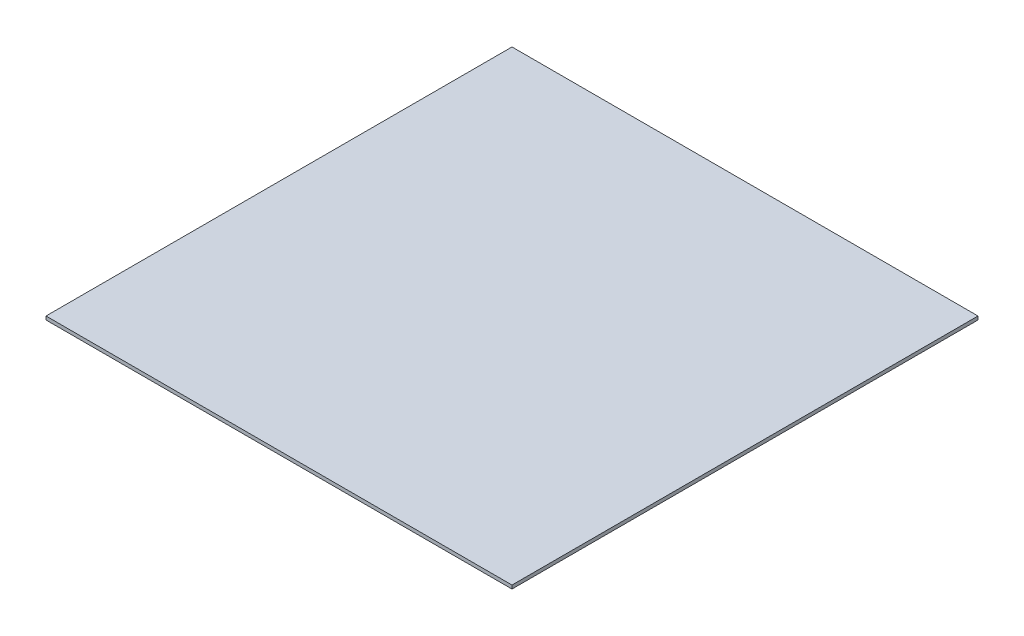
ISO-10303-21;
HEADER;
FILE_DESCRIPTION(('STEP AP214'),'2;1');
FILE_NAME('part.step','',(''),(''),'','','');
FILE_SCHEMA(('AUTOMOTIVE_DESIGN { 1 0 10303 214 1 1 1 1 }'));
ENDSEC;
DATA;
#1=APPLICATION_CONTEXT('core data for automotive mechanical design processes');
#2=APPLICATION_PROTOCOL_DEFINITION('international standard','automotive_design',2000,#1);
#3=PRODUCT_CONTEXT('',#1,'mechanical');
#4=PRODUCT('Part','Part','',(#3));
#5=PRODUCT_RELATED_PRODUCT_CATEGORY('part','',(#4));
#6=PRODUCT_DEFINITION_FORMATION('','',#4);
#7=PRODUCT_DEFINITION_CONTEXT('part definition',#1,'design');
#8=PRODUCT_DEFINITION('design','',#6,#7);
#9=PRODUCT_DEFINITION_SHAPE('','',#8);
#10=(LENGTH_UNIT() NAMED_UNIT(*) SI_UNIT(.MILLI.,.METRE.));
#11=(NAMED_UNIT(*) PLANE_ANGLE_UNIT() SI_UNIT($,.RADIAN.));
#12=(NAMED_UNIT(*) SI_UNIT($,.STERADIAN.) SOLID_ANGLE_UNIT());
#13=UNCERTAINTY_MEASURE_WITH_UNIT(LENGTH_MEASURE(1.E-05),#10,'distance_accuracy_value','');
#14=(GEOMETRIC_REPRESENTATION_CONTEXT(3) GLOBAL_UNCERTAINTY_ASSIGNED_CONTEXT((#13)) GLOBAL_UNIT_ASSIGNED_CONTEXT((#10,
#11,#12)) REPRESENTATION_CONTEXT('',''));
#15=CARTESIAN_POINT('',(0.,0.,0.));
#16=DIRECTION('',(0.,0.,1.));
#17=DIRECTION('',(1.,0.,0.));
#18=AXIS2_PLACEMENT_3D('',#15,#16,#17);
#19=CARTESIAN_POINT('',(106.75,1.6,-106.75));
#20=DIRECTION('',(-1.,0.,0.));
#21=DIRECTION('',(0.,0.,1.));
#22=AXIS2_PLACEMENT_3D('',#19,#20,#21);
#23=PLANE('',#22);
#24=DIRECTION('',(0.,0.,-1.));
#25=VECTOR('',#24,1.);
#26=CARTESIAN_POINT('',(106.75,0.,-106.75));
#27=LINE('',#26,#25);
#28=CARTESIAN_POINT('',(106.75,0.,106.75));
#29=VERTEX_POINT('',#28);
#30=CARTESIAN_POINT('',(106.75,0.,-106.75));
#31=VERTEX_POINT('',#30);
#32=EDGE_CURVE('E97',#29,#31,#27,.T.);
#33=ORIENTED_EDGE('',*,*,#32,.T.);
#34=DIRECTION('',(0.,-1.,0.));
#35=VECTOR('',#34,1.);
#36=CARTESIAN_POINT('',(106.75,1.6,-106.75));
#37=LINE('',#36,#35);
#38=CARTESIAN_POINT('',(106.75,1.6,-106.75));
#39=VERTEX_POINT('',#38);
#40=EDGE_CURVE('E11',#39,#31,#37,.T.);
#41=ORIENTED_EDGE('',*,*,#40,.F.);
#42=DIRECTION('',(0.,0.,-1.));
#43=VECTOR('',#42,1.);
#44=CARTESIAN_POINT('',(106.75,1.6,-106.75));
#45=LINE('',#44,#43);
#46=CARTESIAN_POINT('',(106.75,1.6,106.75));
#47=VERTEX_POINT('',#46);
#48=EDGE_CURVE('E85',#47,#39,#45,.T.);
#49=ORIENTED_EDGE('',*,*,#48,.F.);
#50=DIRECTION('',(0.,-1.,0.));
#51=VECTOR('',#50,1.);
#52=CARTESIAN_POINT('',(106.75,1.6,106.75));
#53=LINE('',#52,#51);
#54=EDGE_CURVE('E93',#47,#29,#53,.T.);
#55=ORIENTED_EDGE('',*,*,#54,.T.);
#56=EDGE_LOOP('',(#33,#41,#49,#55));
#57=FACE_BOUND('',#56,.T.);
#58=ADVANCED_FACE('F34',(#57),#23,.F.);
#59=CARTESIAN_POINT('',(-106.75,1.6,-106.75));
#60=DIRECTION('',(0.,0.,1.));
#61=DIRECTION('',(1.,0.,0.));
#62=AXIS2_PLACEMENT_3D('',#59,#60,#61);
#63=PLANE('',#62);
#64=DIRECTION('',(-1.,0.,0.));
#65=VECTOR('',#64,1.);
#66=CARTESIAN_POINT('',(-106.75,0.,-106.75));
#67=LINE('',#66,#65);
#68=CARTESIAN_POINT('',(-106.75,0.,-106.75));
#69=VERTEX_POINT('',#68);
#70=EDGE_CURVE('E89',#31,#69,#67,.T.);
#71=ORIENTED_EDGE('',*,*,#70,.T.);
#72=DIRECTION('',(0.,-1.,0.));
#73=VECTOR('',#72,1.);
#74=CARTESIAN_POINT('',(-106.75,1.6,-106.75));
#75=LINE('',#74,#73);
#76=CARTESIAN_POINT('',(-106.75,1.6,-106.75));
#77=VERTEX_POINT('',#76);
#78=EDGE_CURVE('E42',#77,#69,#75,.T.);
#79=ORIENTED_EDGE('',*,*,#78,.F.);
#80=DIRECTION('',(-1.,0.,0.));
#81=VECTOR('',#80,1.);
#82=CARTESIAN_POINT('',(-106.75,1.6,-106.75));
#83=LINE('',#82,#81);
#84=EDGE_CURVE('E80',#39,#77,#83,.T.);
#85=ORIENTED_EDGE('',*,*,#84,.F.);
#86=ORIENTED_EDGE('',*,*,#40,.T.);
#87=EDGE_LOOP('',(#71,#79,#85,#86));
#88=FACE_BOUND('',#87,.T.);
#89=ADVANCED_FACE('F88',(#88),#63,.F.);
#90=CARTESIAN_POINT('',(-106.75,1.6,-106.75));
#91=DIRECTION('',(1.,0.,0.));
#92=DIRECTION('',(0.,0.,-1.));
#93=AXIS2_PLACEMENT_3D('',#90,#91,#92);
#94=PLANE('',#93);
#95=DIRECTION('',(0.,0.,1.));
#96=VECTOR('',#95,1.);
#97=CARTESIAN_POINT('',(-106.75,0.,-106.75));
#98=LINE('',#97,#96);
#99=CARTESIAN_POINT('',(-106.75,0.,106.75));
#100=VERTEX_POINT('',#99);
#101=EDGE_CURVE('E67',#69,#100,#98,.T.);
#102=ORIENTED_EDGE('',*,*,#101,.T.);
#103=DIRECTION('',(0.,-1.,0.));
#104=VECTOR('',#103,1.);
#105=CARTESIAN_POINT('',(-106.75,1.6,106.75));
#106=LINE('',#105,#104);
#107=CARTESIAN_POINT('',(-106.75,1.6,106.75));
#108=VERTEX_POINT('',#107);
#109=EDGE_CURVE('E90',#108,#100,#106,.T.);
#110=ORIENTED_EDGE('',*,*,#109,.F.);
#111=DIRECTION('',(0.,0.,1.));
#112=VECTOR('',#111,1.);
#113=CARTESIAN_POINT('',(-106.75,1.6,-106.75));
#114=LINE('',#113,#112);
#115=EDGE_CURVE('E83',#77,#108,#114,.T.);
#116=ORIENTED_EDGE('',*,*,#115,.F.);
#117=ORIENTED_EDGE('',*,*,#78,.T.);
#118=EDGE_LOOP('',(#102,#110,#116,#117));
#119=FACE_BOUND('',#118,.T.);
#120=ADVANCED_FACE('F91',(#119),#94,.F.);
#121=CARTESIAN_POINT('',(-106.75,1.6,106.75));
#122=DIRECTION('',(0.,0.,-1.));
#123=DIRECTION('',(-1.,0.,0.));
#124=AXIS2_PLACEMENT_3D('',#121,#122,#123);
#125=PLANE('',#124);
#126=DIRECTION('',(1.,0.,0.));
#127=VECTOR('',#126,1.);
#128=CARTESIAN_POINT('',(-106.75,0.,106.75));
#129=LINE('',#128,#127);
#130=EDGE_CURVE('E73',#100,#29,#129,.T.);
#131=ORIENTED_EDGE('',*,*,#130,.T.);
#132=ORIENTED_EDGE('',*,*,#54,.F.);
#133=DIRECTION('',(1.,0.,0.));
#134=VECTOR('',#133,1.);
#135=CARTESIAN_POINT('',(-106.75,1.6,106.75));
#136=LINE('',#135,#134);
#137=EDGE_CURVE('E50',#108,#47,#136,.T.);
#138=ORIENTED_EDGE('',*,*,#137,.F.);
#139=ORIENTED_EDGE('',*,*,#109,.T.);
#140=EDGE_LOOP('',(#131,#132,#138,#139));
#141=FACE_BOUND('',#140,.T.);
#142=ADVANCED_FACE('F104',(#141),#125,.F.);
#143=CARTESIAN_POINT('',(0.,1.6,0.));
#144=DIRECTION('',(0.,1.,0.));
#145=DIRECTION('',(0.,0.,1.));
#146=AXIS2_PLACEMENT_3D('',#143,#144,#145);
#147=PLANE('',#146);
#148=ORIENTED_EDGE('',*,*,#48,.T.);
#149=ORIENTED_EDGE('',*,*,#84,.T.);
#150=ORIENTED_EDGE('',*,*,#115,.T.);
#151=ORIENTED_EDGE('',*,*,#137,.T.);
#152=EDGE_LOOP('',(#148,#149,#150,#151));
#153=FACE_BOUND('',#152,.T.);
#154=ADVANCED_FACE('F81',(#153),#147,.T.);
#155=CARTESIAN_POINT('',(0.,0.,0.));
#156=DIRECTION('',(0.,1.,0.));
#157=DIRECTION('',(0.,0.,1.));
#158=AXIS2_PLACEMENT_3D('',#155,#156,#157);
#159=PLANE('',#158);
#160=ORIENTED_EDGE('',*,*,#32,.F.);
#161=ORIENTED_EDGE('',*,*,#130,.F.);
#162=ORIENTED_EDGE('',*,*,#101,.F.);
#163=ORIENTED_EDGE('',*,*,#70,.F.);
#164=EDGE_LOOP('',(#160,#161,#162,#163));
#165=FACE_BOUND('',#164,.T.);
#166=ADVANCED_FACE('F107',(#165),#159,.F.);
#167=CLOSED_SHELL('',(#58,#89,#120,#142,#154,#166));
#168=MANIFOLD_SOLID_BREP('B2',#167);
#169=ADVANCED_BREP_SHAPE_REPRESENTATION('',(#18,#168),#14);
#170=SHAPE_DEFINITION_REPRESENTATION(#9,#169);
ENDSEC;
END-ISO-10303-21;
